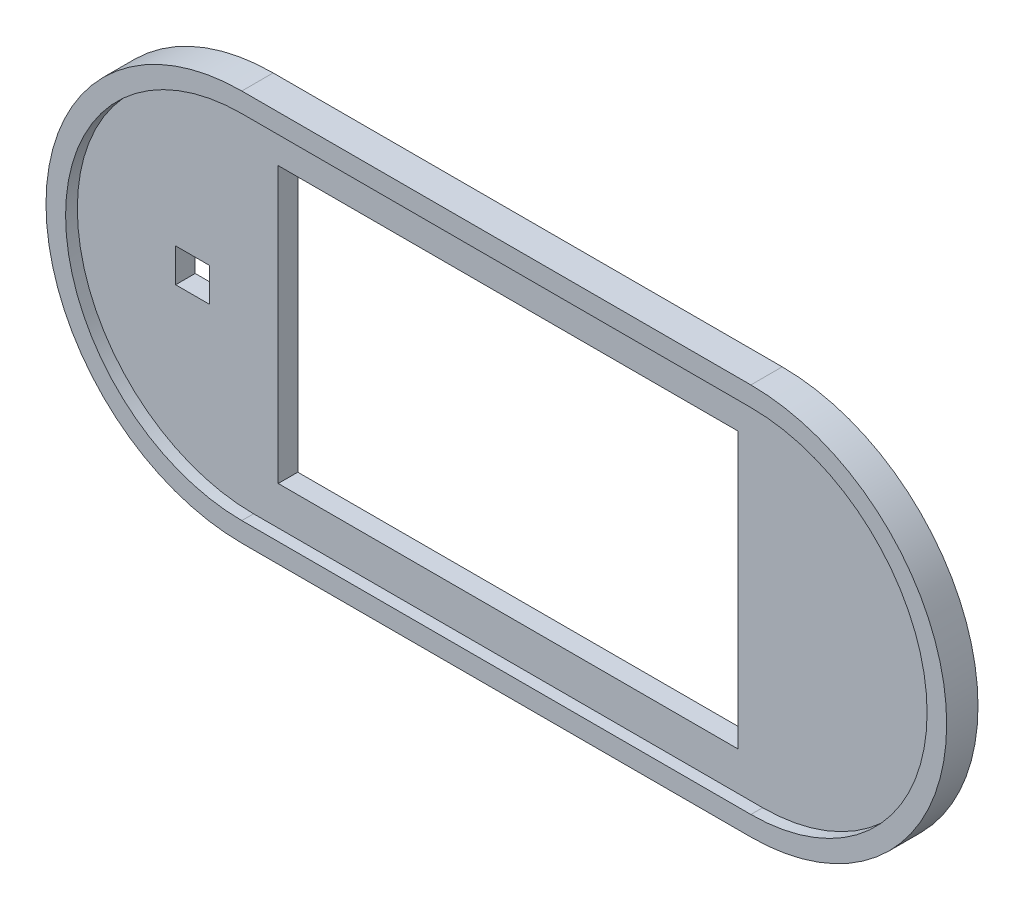
ISO-10303-21;
HEADER;
FILE_DESCRIPTION(('STEP AP214'),'2;1');
FILE_NAME('part.step','',(''),(''),'','','');
FILE_SCHEMA(('AUTOMOTIVE_DESIGN { 1 0 10303 214 1 1 1 1 }'));
ENDSEC;
DATA;
#1=APPLICATION_CONTEXT('core data for automotive mechanical design processes');
#2=APPLICATION_PROTOCOL_DEFINITION('international standard','automotive_design',2000,#1);
#3=PRODUCT_CONTEXT('',#1,'mechanical');
#4=PRODUCT('Part','Part','',(#3));
#5=PRODUCT_RELATED_PRODUCT_CATEGORY('part','',(#4));
#6=PRODUCT_DEFINITION_FORMATION('','',#4);
#7=PRODUCT_DEFINITION_CONTEXT('part definition',#1,'design');
#8=PRODUCT_DEFINITION('design','',#6,#7);
#9=PRODUCT_DEFINITION_SHAPE('','',#8);
#10=(LENGTH_UNIT() NAMED_UNIT(*) SI_UNIT(.MILLI.,.METRE.));
#11=(NAMED_UNIT(*) PLANE_ANGLE_UNIT() SI_UNIT($,.RADIAN.));
#12=(NAMED_UNIT(*) SI_UNIT($,.STERADIAN.) SOLID_ANGLE_UNIT());
#13=UNCERTAINTY_MEASURE_WITH_UNIT(LENGTH_MEASURE(1.E-05),#10,'distance_accuracy_value','');
#14=(GEOMETRIC_REPRESENTATION_CONTEXT(3) GLOBAL_UNCERTAINTY_ASSIGNED_CONTEXT((#13)) GLOBAL_UNIT_ASSIGNED_CONTEXT((#10,
#11,#12)) REPRESENTATION_CONTEXT('',''));
#15=CARTESIAN_POINT('',(0.,0.,0.));
#16=DIRECTION('',(0.,0.,1.));
#17=DIRECTION('',(1.,0.,0.));
#18=AXIS2_PLACEMENT_3D('',#15,#16,#17);
#19=CARTESIAN_POINT('',(0.,-50.,8.));
#20=DIRECTION('',(0.,0.,-1.));
#21=DIRECTION('',(-1.,0.,0.));
#22=AXIS2_PLACEMENT_3D('',#19,#20,#21);
#23=PLANE('',#22);
#24=CARTESIAN_POINT('',(0.,-50.,8.));
#25=DIRECTION('',(0.,0.,1.));
#26=DIRECTION('',(-1.,0.,0.));
#27=AXIS2_PLACEMENT_3D('',#24,#25,#26);
#28=CIRCLE('',#27,50.);
#29=CARTESIAN_POINT('',(0.,-100.,8.));
#30=VERTEX_POINT('',#29);
#31=CARTESIAN_POINT('',(0.,0.,8.));
#32=VERTEX_POINT('',#31);
#33=EDGE_CURVE('E250',#30,#32,#28,.T.);
#34=ORIENTED_EDGE('',*,*,#33,.T.);
#35=DIRECTION('',(-1.,0.,0.));
#36=VECTOR('',#35,1.);
#37=CARTESIAN_POINT('',(0.,0.,8.));
#38=LINE('',#37,#36);
#39=CARTESIAN_POINT('',(-130.,0.,8.));
#40=VERTEX_POINT('',#39);
#41=EDGE_CURVE('E253',#32,#40,#38,.T.);
#42=ORIENTED_EDGE('',*,*,#41,.T.);
#43=CARTESIAN_POINT('',(-130.,-50.,8.));
#44=DIRECTION('',(0.,0.,1.));
#45=DIRECTION('',(1.,0.,0.));
#46=AXIS2_PLACEMENT_3D('',#43,#44,#45);
#47=CIRCLE('',#46,50.);
#48=CARTESIAN_POINT('',(-130.,-100.,8.));
#49=VERTEX_POINT('',#48);
#50=EDGE_CURVE('E256',#40,#49,#47,.T.);
#51=ORIENTED_EDGE('',*,*,#50,.T.);
#52=DIRECTION('',(1.,0.,0.));
#53=VECTOR('',#52,1.);
#54=CARTESIAN_POINT('',(0.,-100.,8.));
#55=LINE('',#54,#53);
#56=EDGE_CURVE('E258',#49,#30,#55,.T.);
#57=ORIENTED_EDGE('',*,*,#56,.T.);
#58=EDGE_LOOP('',(#34,#42,#51,#57));
#59=FACE_BOUND('',#58,.T.);
#60=CARTESIAN_POINT('',(0.,-50.,8.));
#61=DIRECTION('',(0.,0.,-1.));
#62=DIRECTION('',(-1.,0.,0.));
#63=AXIS2_PLACEMENT_3D('',#60,#61,#62);
#64=CIRCLE('',#63,45.);
#65=CARTESIAN_POINT('',(0.,-95.,8.));
#66=VERTEX_POINT('',#65);
#67=CARTESIAN_POINT('',(0.,-5.,8.));
#68=VERTEX_POINT('',#67);
#69=EDGE_CURVE('E242',#66,#68,#64,.F.);
#70=ORIENTED_EDGE('',*,*,#69,.F.);
#71=DIRECTION('',(1.,0.,0.));
#72=VECTOR('',#71,1.);
#73=CARTESIAN_POINT('',(0.,-95.,8.));
#74=LINE('',#73,#72);
#75=CARTESIAN_POINT('',(-130.,-95.,8.));
#76=VERTEX_POINT('',#75);
#77=EDGE_CURVE('E232',#76,#66,#74,.T.);
#78=ORIENTED_EDGE('',*,*,#77,.F.);
#79=CARTESIAN_POINT('',(-130.,-50.,8.));
#80=DIRECTION('',(0.,0.,-1.));
#81=DIRECTION('',(-1.,0.,0.));
#82=AXIS2_PLACEMENT_3D('',#79,#80,#81);
#83=CIRCLE('',#82,45.);
#84=CARTESIAN_POINT('',(-130.,-5.00000000000002,8.));
#85=VERTEX_POINT('',#84);
#86=EDGE_CURVE('E246',#85,#76,#83,.F.);
#87=ORIENTED_EDGE('',*,*,#86,.F.);
#88=DIRECTION('',(-1.,0.,0.));
#89=VECTOR('',#88,1.);
#90=CARTESIAN_POINT('',(0.,-5.,8.));
#91=LINE('',#90,#89);
#92=EDGE_CURVE('E244',#68,#85,#91,.T.);
#93=ORIENTED_EDGE('',*,*,#92,.F.);
#94=EDGE_LOOP('',(#70,#78,#87,#93));
#95=FACE_BOUND('',#94,.T.);
#96=ADVANCED_FACE('F37',(#59,#95),#23,.F.);
#97=CARTESIAN_POINT('',(0.,-50.,8.));
#98=DIRECTION('',(0.,0.,-1.));
#99=DIRECTION('',(-1.,0.,0.));
#100=AXIS2_PLACEMENT_3D('',#97,#98,#99);
#101=CYLINDRICAL_SURFACE('',#100,50.);
#102=CARTESIAN_POINT('',(0.,-50.,0.));
#103=DIRECTION('',(0.,0.,1.));
#104=DIRECTION('',(-1.,0.,0.));
#105=AXIS2_PLACEMENT_3D('',#102,#103,#104);
#106=CIRCLE('',#105,50.);
#107=CARTESIAN_POINT('',(0.,-100.,0.));
#108=VERTEX_POINT('',#107);
#109=CARTESIAN_POINT('',(0.,0.,0.));
#110=VERTEX_POINT('',#109);
#111=EDGE_CURVE('E226',#108,#110,#106,.T.);
#112=ORIENTED_EDGE('',*,*,#111,.T.);
#113=DIRECTION('',(0.,0.,-1.));
#114=VECTOR('',#113,1.);
#115=CARTESIAN_POINT('',(0.,0.,8.));
#116=LINE('',#115,#114);
#117=EDGE_CURVE('E11',#32,#110,#116,.T.);
#118=ORIENTED_EDGE('',*,*,#117,.F.);
#119=ORIENTED_EDGE('',*,*,#33,.F.);
#120=DIRECTION('',(0.,0.,-1.));
#121=VECTOR('',#120,1.);
#122=CARTESIAN_POINT('',(0.,-100.,8.));
#123=LINE('',#122,#121);
#124=EDGE_CURVE('E260',#30,#108,#123,.T.);
#125=ORIENTED_EDGE('',*,*,#124,.T.);
#126=EDGE_LOOP('',(#112,#118,#119,#125));
#127=FACE_BOUND('',#126,.T.);
#128=ADVANCED_FACE('F39',(#127),#101,.T.);
#129=CARTESIAN_POINT('',(0.,0.,8.));
#130=DIRECTION('',(0.,-1.,0.));
#131=DIRECTION('',(1.,0.,0.));
#132=AXIS2_PLACEMENT_3D('',#129,#130,#131);
#133=PLANE('',#132);
#134=DIRECTION('',(-1.,0.,0.));
#135=VECTOR('',#134,1.);
#136=CARTESIAN_POINT('',(0.,0.,0.));
#137=LINE('',#136,#135);
#138=CARTESIAN_POINT('',(-130.,0.,0.));
#139=VERTEX_POINT('',#138);
#140=EDGE_CURVE('E263',#110,#139,#137,.T.);
#141=ORIENTED_EDGE('',*,*,#140,.T.);
#142=DIRECTION('',(0.,0.,-1.));
#143=VECTOR('',#142,1.);
#144=CARTESIAN_POINT('',(-130.,0.,8.));
#145=LINE('',#144,#143);
#146=EDGE_CURVE('E45',#40,#139,#145,.T.);
#147=ORIENTED_EDGE('',*,*,#146,.F.);
#148=ORIENTED_EDGE('',*,*,#41,.F.);
#149=ORIENTED_EDGE('',*,*,#117,.T.);
#150=EDGE_LOOP('',(#141,#147,#148,#149));
#151=FACE_BOUND('',#150,.T.);
#152=ADVANCED_FACE('F293',(#151),#133,.F.);
#153=CARTESIAN_POINT('',(-130.,-50.,8.));
#154=DIRECTION('',(0.,0.,-1.));
#155=DIRECTION('',(-1.,0.,0.));
#156=AXIS2_PLACEMENT_3D('',#153,#154,#155);
#157=CYLINDRICAL_SURFACE('',#156,50.);
#158=CARTESIAN_POINT('',(-130.,-50.,0.));
#159=DIRECTION('',(0.,0.,1.));
#160=DIRECTION('',(1.,0.,0.));
#161=AXIS2_PLACEMENT_3D('',#158,#159,#160);
#162=CIRCLE('',#161,50.);
#163=CARTESIAN_POINT('',(-130.,-100.,0.));
#164=VERTEX_POINT('',#163);
#165=EDGE_CURVE('E265',#139,#164,#162,.T.);
#166=ORIENTED_EDGE('',*,*,#165,.T.);
#167=DIRECTION('',(0.,0.,-1.));
#168=VECTOR('',#167,1.);
#169=CARTESIAN_POINT('',(-130.,-100.,8.));
#170=LINE('',#169,#168);
#171=EDGE_CURVE('E270',#49,#164,#170,.T.);
#172=ORIENTED_EDGE('',*,*,#171,.F.);
#173=ORIENTED_EDGE('',*,*,#50,.F.);
#174=ORIENTED_EDGE('',*,*,#146,.T.);
#175=EDGE_LOOP('',(#166,#172,#173,#174));
#176=FACE_BOUND('',#175,.T.);
#177=ADVANCED_FACE('F277',(#176),#157,.T.);
#178=CARTESIAN_POINT('',(0.,-100.,8.));
#179=DIRECTION('',(0.,1.,0.));
#180=DIRECTION('',(-1.,0.,0.));
#181=AXIS2_PLACEMENT_3D('',#178,#179,#180);
#182=PLANE('',#181);
#183=DIRECTION('',(1.,0.,0.));
#184=VECTOR('',#183,1.);
#185=CARTESIAN_POINT('',(0.,-100.,0.));
#186=LINE('',#185,#184);
#187=EDGE_CURVE('E254',#164,#108,#186,.T.);
#188=ORIENTED_EDGE('',*,*,#187,.T.);
#189=ORIENTED_EDGE('',*,*,#124,.F.);
#190=ORIENTED_EDGE('',*,*,#56,.F.);
#191=ORIENTED_EDGE('',*,*,#171,.T.);
#192=EDGE_LOOP('',(#188,#189,#190,#191));
#193=FACE_BOUND('',#192,.T.);
#194=ADVANCED_FACE('F286',(#193),#182,.F.);
#195=CARTESIAN_POINT('',(0.,-50.,0.));
#196=DIRECTION('',(0.,0.,-1.));
#197=DIRECTION('',(-1.,0.,0.));
#198=AXIS2_PLACEMENT_3D('',#195,#196,#197);
#199=PLANE('',#198);
#200=DIRECTION('',(0.,1.,0.));
#201=VECTOR('',#200,1.);
#202=CARTESIAN_POINT('',(-123.7,-85.15,0.));
#203=LINE('',#202,#201);
#204=CARTESIAN_POINT('',(-123.7,-85.15,0.));
#205=VERTEX_POINT('',#204);
#206=CARTESIAN_POINT('',(-123.7,-14.85,0.));
#207=VERTEX_POINT('',#206);
#208=EDGE_CURVE('E52',#205,#207,#203,.T.);
#209=ORIENTED_EDGE('',*,*,#208,.F.);
#210=DIRECTION('',(-1.,0.,0.));
#211=VECTOR('',#210,1.);
#212=CARTESIAN_POINT('',(-6.29999999999999,-85.15,0.));
#213=LINE('',#212,#211);
#214=CARTESIAN_POINT('',(-6.29999999999999,-85.15,0.));
#215=VERTEX_POINT('',#214);
#216=EDGE_CURVE('E171',#215,#205,#213,.T.);
#217=ORIENTED_EDGE('',*,*,#216,.F.);
#218=DIRECTION('',(0.,-1.,0.));
#219=VECTOR('',#218,1.);
#220=CARTESIAN_POINT('',(-6.29999999999999,-85.15,0.));
#221=LINE('',#220,#219);
#222=CARTESIAN_POINT('',(-6.29999999999999,-14.85,0.));
#223=VERTEX_POINT('',#222);
#224=EDGE_CURVE('E174',#223,#215,#221,.T.);
#225=ORIENTED_EDGE('',*,*,#224,.F.);
#226=DIRECTION('',(1.,0.,0.));
#227=VECTOR('',#226,1.);
#228=CARTESIAN_POINT('',(-6.29999999999999,-14.85,0.));
#229=LINE('',#228,#227);
#230=EDGE_CURVE('E180',#207,#223,#229,.T.);
#231=ORIENTED_EDGE('',*,*,#230,.F.);
#232=EDGE_LOOP('',(#209,#217,#225,#231));
#233=FACE_BOUND('',#232,.T.);
#234=DIRECTION('',(0.,1.,0.));
#235=VECTOR('',#234,1.);
#236=CARTESIAN_POINT('',(-149.896085378825,-45.7,0.));
#237=LINE('',#236,#235);
#238=CARTESIAN_POINT('',(-149.896085378825,-54.3,0.));
#239=VERTEX_POINT('',#238);
#240=CARTESIAN_POINT('',(-149.896085378825,-45.7,0.));
#241=VERTEX_POINT('',#240);
#242=EDGE_CURVE('E60',#239,#241,#237,.T.);
#243=ORIENTED_EDGE('',*,*,#242,.F.);
#244=DIRECTION('',(-1.,0.,0.));
#245=VECTOR('',#244,1.);
#246=CARTESIAN_POINT('',(-141.296085378825,-54.3,0.));
#247=LINE('',#246,#245);
#248=CARTESIAN_POINT('',(-141.296085378825,-54.3,0.));
#249=VERTEX_POINT('',#248);
#250=EDGE_CURVE('E195',#249,#239,#247,.T.);
#251=ORIENTED_EDGE('',*,*,#250,.F.);
#252=DIRECTION('',(0.,-1.,0.));
#253=VECTOR('',#252,1.);
#254=CARTESIAN_POINT('',(-141.296085378825,-45.7,0.));
#255=LINE('',#254,#253);
#256=CARTESIAN_POINT('',(-141.296085378825,-45.7,0.));
#257=VERTEX_POINT('',#256);
#258=EDGE_CURVE('E209',#257,#249,#255,.T.);
#259=ORIENTED_EDGE('',*,*,#258,.F.);
#260=DIRECTION('',(1.,0.,0.));
#261=VECTOR('',#260,1.);
#262=CARTESIAN_POINT('',(-141.296085378825,-45.7,0.));
#263=LINE('',#262,#261);
#264=EDGE_CURVE('E206',#241,#257,#263,.T.);
#265=ORIENTED_EDGE('',*,*,#264,.F.);
#266=EDGE_LOOP('',(#243,#251,#259,#265));
#267=FACE_BOUND('',#266,.T.);
#268=ORIENTED_EDGE('',*,*,#111,.F.);
#269=ORIENTED_EDGE('',*,*,#187,.F.);
#270=ORIENTED_EDGE('',*,*,#165,.F.);
#271=ORIENTED_EDGE('',*,*,#140,.F.);
#272=EDGE_LOOP('',(#268,#269,#270,#271));
#273=FACE_BOUND('',#272,.T.);
#274=ADVANCED_FACE('F283',(#233,#267,#273),#199,.T.);
#275=CARTESIAN_POINT('',(0.,-50.,8.));
#276=DIRECTION('',(0.,0.,-1.));
#277=DIRECTION('',(-1.,0.,0.));
#278=AXIS2_PLACEMENT_3D('',#275,#276,#277);
#279=CYLINDRICAL_SURFACE('',#278,45.);
#280=CARTESIAN_POINT('',(0.,-50.,5.));
#281=DIRECTION('',(0.,0.,-1.));
#282=DIRECTION('',(-1.,0.,0.));
#283=AXIS2_PLACEMENT_3D('',#280,#281,#282);
#284=CIRCLE('',#283,45.);
#285=CARTESIAN_POINT('',(0.,-95.,5.));
#286=VERTEX_POINT('',#285);
#287=CARTESIAN_POINT('',(0.,-5.,5.));
#288=VERTEX_POINT('',#287);
#289=EDGE_CURVE('E187',#286,#288,#284,.F.);
#290=ORIENTED_EDGE('',*,*,#289,.F.);
#291=DIRECTION('',(0.,0.,-1.));
#292=VECTOR('',#291,1.);
#293=CARTESIAN_POINT('',(0.,-95.,8.));
#294=LINE('',#293,#292);
#295=EDGE_CURVE('E228',#66,#286,#294,.T.);
#296=ORIENTED_EDGE('',*,*,#295,.F.);
#297=ORIENTED_EDGE('',*,*,#69,.T.);
#298=DIRECTION('',(0.,0.,1.));
#299=VECTOR('',#298,1.);
#300=CARTESIAN_POINT('',(0.,-5.,8.));
#301=LINE('',#300,#299);
#302=EDGE_CURVE('E223',#68,#288,#301,.F.);
#303=ORIENTED_EDGE('',*,*,#302,.T.);
#304=EDGE_LOOP('',(#290,#296,#297,#303));
#305=FACE_BOUND('',#304,.T.);
#306=ADVANCED_FACE('F309',(#305),#279,.F.);
#307=CARTESIAN_POINT('',(0.,-5.,8.));
#308=DIRECTION('',(0.,-1.,0.));
#309=DIRECTION('',(1.,0.,0.));
#310=AXIS2_PLACEMENT_3D('',#307,#308,#309);
#311=PLANE('',#310);
#312=DIRECTION('',(-1.,0.,0.));
#313=VECTOR('',#312,1.);
#314=CARTESIAN_POINT('',(0.,-5.,5.));
#315=LINE('',#314,#313);
#316=CARTESIAN_POINT('',(-130.,-5.00000000000002,5.));
#317=VERTEX_POINT('',#316);
#318=EDGE_CURVE('E222',#288,#317,#315,.T.);
#319=ORIENTED_EDGE('',*,*,#318,.F.);
#320=ORIENTED_EDGE('',*,*,#302,.F.);
#321=ORIENTED_EDGE('',*,*,#92,.T.);
#322=DIRECTION('',(0.,0.,-1.));
#323=VECTOR('',#322,1.);
#324=CARTESIAN_POINT('',(-130.,-5.00000000000002,8.));
#325=LINE('',#324,#323);
#326=EDGE_CURVE('E227',#85,#317,#325,.T.);
#327=ORIENTED_EDGE('',*,*,#326,.T.);
#328=EDGE_LOOP('',(#319,#320,#321,#327));
#329=FACE_BOUND('',#328,.T.);
#330=ADVANCED_FACE('F328',(#329),#311,.T.);
#331=CARTESIAN_POINT('',(-130.,-50.,8.));
#332=DIRECTION('',(0.,0.,-1.));
#333=DIRECTION('',(-1.,0.,0.));
#334=AXIS2_PLACEMENT_3D('',#331,#332,#333);
#335=CYLINDRICAL_SURFACE('',#334,45.);
#336=CARTESIAN_POINT('',(-130.,-50.,5.));
#337=DIRECTION('',(0.,0.,-1.));
#338=DIRECTION('',(-1.,0.,0.));
#339=AXIS2_PLACEMENT_3D('',#336,#337,#338);
#340=CIRCLE('',#339,45.);
#341=CARTESIAN_POINT('',(-130.,-95.,5.));
#342=VERTEX_POINT('',#341);
#343=EDGE_CURVE('E234',#317,#342,#340,.F.);
#344=ORIENTED_EDGE('',*,*,#343,.F.);
#345=ORIENTED_EDGE('',*,*,#326,.F.);
#346=ORIENTED_EDGE('',*,*,#86,.T.);
#347=DIRECTION('',(0.,0.,1.));
#348=VECTOR('',#347,1.);
#349=CARTESIAN_POINT('',(-130.,-95.,8.));
#350=LINE('',#349,#348);
#351=EDGE_CURVE('E231',#76,#342,#350,.F.);
#352=ORIENTED_EDGE('',*,*,#351,.T.);
#353=EDGE_LOOP('',(#344,#345,#346,#352));
#354=FACE_BOUND('',#353,.T.);
#355=ADVANCED_FACE('F336',(#354),#335,.F.);
#356=CARTESIAN_POINT('',(0.,-95.,8.));
#357=DIRECTION('',(0.,1.,0.));
#358=DIRECTION('',(-1.,0.,0.));
#359=AXIS2_PLACEMENT_3D('',#356,#357,#358);
#360=PLANE('',#359);
#361=DIRECTION('',(1.,0.,0.));
#362=VECTOR('',#361,1.);
#363=CARTESIAN_POINT('',(0.,-95.,5.));
#364=LINE('',#363,#362);
#365=EDGE_CURVE('E238',#342,#286,#364,.T.);
#366=ORIENTED_EDGE('',*,*,#365,.F.);
#367=ORIENTED_EDGE('',*,*,#351,.F.);
#368=ORIENTED_EDGE('',*,*,#77,.T.);
#369=ORIENTED_EDGE('',*,*,#295,.T.);
#370=EDGE_LOOP('',(#366,#367,#368,#369));
#371=FACE_BOUND('',#370,.T.);
#372=ADVANCED_FACE('F344',(#371),#360,.T.);
#373=CARTESIAN_POINT('',(0.,-50.,5.));
#374=DIRECTION('',(0.,0.,-1.));
#375=DIRECTION('',(-1.,0.,0.));
#376=AXIS2_PLACEMENT_3D('',#373,#374,#375);
#377=PLANE('',#376);
#378=DIRECTION('',(-1.,0.,0.));
#379=VECTOR('',#378,1.);
#380=CARTESIAN_POINT('',(-6.29999999999999,-85.15,5.));
#381=LINE('',#380,#379);
#382=CARTESIAN_POINT('',(-6.29999999999999,-85.15,5.));
#383=VERTEX_POINT('',#382);
#384=CARTESIAN_POINT('',(-123.7,-85.15,5.));
#385=VERTEX_POINT('',#384);
#386=EDGE_CURVE('E158',#383,#385,#381,.T.);
#387=ORIENTED_EDGE('',*,*,#386,.T.);
#388=DIRECTION('',(0.,1.,0.));
#389=VECTOR('',#388,1.);
#390=CARTESIAN_POINT('',(-123.7,-85.15,5.));
#391=LINE('',#390,#389);
#392=CARTESIAN_POINT('',(-123.7,-14.85,5.));
#393=VERTEX_POINT('',#392);
#394=EDGE_CURVE('E152',#385,#393,#391,.T.);
#395=ORIENTED_EDGE('',*,*,#394,.T.);
#396=DIRECTION('',(1.,0.,0.));
#397=VECTOR('',#396,1.);
#398=CARTESIAN_POINT('',(-6.29999999999999,-14.85,5.));
#399=LINE('',#398,#397);
#400=CARTESIAN_POINT('',(-6.29999999999999,-14.85,5.));
#401=VERTEX_POINT('',#400);
#402=EDGE_CURVE('E162',#393,#401,#399,.T.);
#403=ORIENTED_EDGE('',*,*,#402,.T.);
#404=DIRECTION('',(0.,-1.,0.));
#405=VECTOR('',#404,1.);
#406=CARTESIAN_POINT('',(-6.29999999999999,-85.15,5.));
#407=LINE('',#406,#405);
#408=EDGE_CURVE('E166',#401,#383,#407,.T.);
#409=ORIENTED_EDGE('',*,*,#408,.T.);
#410=EDGE_LOOP('',(#387,#395,#403,#409));
#411=FACE_BOUND('',#410,.T.);
#412=DIRECTION('',(-1.,0.,0.));
#413=VECTOR('',#412,1.);
#414=CARTESIAN_POINT('',(-141.296085378825,-54.3,5.));
#415=LINE('',#414,#413);
#416=CARTESIAN_POINT('',(-141.296085378825,-54.3,5.));
#417=VERTEX_POINT('',#416);
#418=CARTESIAN_POINT('',(-149.896085378825,-54.3,5.));
#419=VERTEX_POINT('',#418);
#420=EDGE_CURVE('E201',#417,#419,#415,.T.);
#421=ORIENTED_EDGE('',*,*,#420,.T.);
#422=DIRECTION('',(0.,1.,0.));
#423=VECTOR('',#422,1.);
#424=CARTESIAN_POINT('',(-149.896085378825,-45.7,5.));
#425=LINE('',#424,#423);
#426=CARTESIAN_POINT('',(-149.896085378825,-45.7,5.));
#427=VERTEX_POINT('',#426);
#428=EDGE_CURVE('E191',#419,#427,#425,.T.);
#429=ORIENTED_EDGE('',*,*,#428,.T.);
#430=DIRECTION('',(1.,0.,0.));
#431=VECTOR('',#430,1.);
#432=CARTESIAN_POINT('',(-141.296085378825,-45.7,5.));
#433=LINE('',#432,#431);
#434=CARTESIAN_POINT('',(-141.296085378825,-45.7,5.));
#435=VERTEX_POINT('',#434);
#436=EDGE_CURVE('E194',#427,#435,#433,.T.);
#437=ORIENTED_EDGE('',*,*,#436,.T.);
#438=DIRECTION('',(0.,-1.,0.));
#439=VECTOR('',#438,1.);
#440=CARTESIAN_POINT('',(-141.296085378825,-45.7,5.));
#441=LINE('',#440,#439);
#442=EDGE_CURVE('E198',#435,#417,#441,.T.);
#443=ORIENTED_EDGE('',*,*,#442,.T.);
#444=EDGE_LOOP('',(#421,#429,#437,#443));
#445=FACE_BOUND('',#444,.T.);
#446=ORIENTED_EDGE('',*,*,#289,.T.);
#447=ORIENTED_EDGE('',*,*,#318,.T.);
#448=ORIENTED_EDGE('',*,*,#343,.T.);
#449=ORIENTED_EDGE('',*,*,#365,.T.);
#450=EDGE_LOOP('',(#446,#447,#448,#449));
#451=FACE_BOUND('',#450,.T.);
#452=ADVANCED_FACE('F168',(#411,#445,#451),#377,.F.);
#453=CARTESIAN_POINT('',(-149.896085378825,-45.7,5.));
#454=DIRECTION('',(-1.,0.,0.));
#455=DIRECTION('',(0.,0.,1.));
#456=AXIS2_PLACEMENT_3D('',#453,#454,#455);
#457=PLANE('',#456);
#458=ORIENTED_EDGE('',*,*,#242,.T.);
#459=DIRECTION('',(0.,0.,-1.));
#460=VECTOR('',#459,1.);
#461=CARTESIAN_POINT('',(-149.896085378825,-45.7,5.));
#462=LINE('',#461,#460);
#463=EDGE_CURVE('E204',#427,#241,#462,.T.);
#464=ORIENTED_EDGE('',*,*,#463,.F.);
#465=ORIENTED_EDGE('',*,*,#428,.F.);
#466=DIRECTION('',(0.,0.,-1.));
#467=VECTOR('',#466,1.);
#468=CARTESIAN_POINT('',(-149.896085378825,-54.3,5.));
#469=LINE('',#468,#467);
#470=EDGE_CURVE('E181',#419,#239,#469,.T.);
#471=ORIENTED_EDGE('',*,*,#470,.T.);
#472=EDGE_LOOP('',(#458,#464,#465,#471));
#473=FACE_BOUND('',#472,.T.);
#474=ADVANCED_FACE('F356',(#473),#457,.F.);
#475=CARTESIAN_POINT('',(-141.296085378825,-54.3,5.));
#476=DIRECTION('',(0.,-1.,0.));
#477=DIRECTION('',(0.,0.,-1.));
#478=AXIS2_PLACEMENT_3D('',#475,#476,#477);
#479=PLANE('',#478);
#480=ORIENTED_EDGE('',*,*,#250,.T.);
#481=ORIENTED_EDGE('',*,*,#470,.F.);
#482=ORIENTED_EDGE('',*,*,#420,.F.);
#483=DIRECTION('',(0.,0.,-1.));
#484=VECTOR('',#483,1.);
#485=CARTESIAN_POINT('',(-141.296085378825,-54.3,5.));
#486=LINE('',#485,#484);
#487=EDGE_CURVE('E215',#417,#249,#486,.T.);
#488=ORIENTED_EDGE('',*,*,#487,.T.);
#489=EDGE_LOOP('',(#480,#481,#482,#488));
#490=FACE_BOUND('',#489,.T.);
#491=ADVANCED_FACE('F362',(#490),#479,.F.);
#492=CARTESIAN_POINT('',(-141.296085378825,-45.7,5.));
#493=DIRECTION('',(1.,0.,0.));
#494=DIRECTION('',(0.,0.,-1.));
#495=AXIS2_PLACEMENT_3D('',#492,#493,#494);
#496=PLANE('',#495);
#497=ORIENTED_EDGE('',*,*,#258,.T.);
#498=ORIENTED_EDGE('',*,*,#487,.F.);
#499=ORIENTED_EDGE('',*,*,#442,.F.);
#500=DIRECTION('',(0.,0.,-1.));
#501=VECTOR('',#500,1.);
#502=CARTESIAN_POINT('',(-141.296085378825,-45.7,5.));
#503=LINE('',#502,#501);
#504=EDGE_CURVE('E217',#435,#257,#503,.T.);
#505=ORIENTED_EDGE('',*,*,#504,.T.);
#506=EDGE_LOOP('',(#497,#498,#499,#505));
#507=FACE_BOUND('',#506,.T.);
#508=ADVANCED_FACE('F369',(#507),#496,.F.);
#509=CARTESIAN_POINT('',(-141.296085378825,-45.7,5.));
#510=DIRECTION('',(0.,1.,0.));
#511=DIRECTION('',(0.,0.,1.));
#512=AXIS2_PLACEMENT_3D('',#509,#510,#511);
#513=PLANE('',#512);
#514=ORIENTED_EDGE('',*,*,#264,.T.);
#515=ORIENTED_EDGE('',*,*,#504,.F.);
#516=ORIENTED_EDGE('',*,*,#436,.F.);
#517=ORIENTED_EDGE('',*,*,#463,.T.);
#518=EDGE_LOOP('',(#514,#515,#516,#517));
#519=FACE_BOUND('',#518,.T.);
#520=ADVANCED_FACE('F377',(#519),#513,.F.);
#521=CARTESIAN_POINT('',(-123.7,-85.15,5.));
#522=DIRECTION('',(-1.,0.,0.));
#523=DIRECTION('',(0.,0.,1.));
#524=AXIS2_PLACEMENT_3D('',#521,#522,#523);
#525=PLANE('',#524);
#526=ORIENTED_EDGE('',*,*,#208,.T.);
#527=DIRECTION('',(0.,0.,-1.));
#528=VECTOR('',#527,1.);
#529=CARTESIAN_POINT('',(-123.7,-14.85,5.));
#530=LINE('',#529,#528);
#531=EDGE_CURVE('E148',#393,#207,#530,.T.);
#532=ORIENTED_EDGE('',*,*,#531,.F.);
#533=ORIENTED_EDGE('',*,*,#394,.F.);
#534=DIRECTION('',(0.,0.,-1.));
#535=VECTOR('',#534,1.);
#536=CARTESIAN_POINT('',(-123.7,-85.15,5.));
#537=LINE('',#536,#535);
#538=EDGE_CURVE('E185',#385,#205,#537,.T.);
#539=ORIENTED_EDGE('',*,*,#538,.T.);
#540=EDGE_LOOP('',(#526,#532,#533,#539));
#541=FACE_BOUND('',#540,.T.);
#542=ADVANCED_FACE('F150',(#541),#525,.F.);
#543=CARTESIAN_POINT('',(-6.29999999999999,-85.15,5.));
#544=DIRECTION('',(0.,-1.,0.));
#545=DIRECTION('',(0.,0.,-1.));
#546=AXIS2_PLACEMENT_3D('',#543,#544,#545);
#547=PLANE('',#546);
#548=ORIENTED_EDGE('',*,*,#216,.T.);
#549=ORIENTED_EDGE('',*,*,#538,.F.);
#550=ORIENTED_EDGE('',*,*,#386,.F.);
#551=DIRECTION('',(0.,0.,-1.));
#552=VECTOR('',#551,1.);
#553=CARTESIAN_POINT('',(-6.29999999999999,-85.15,5.));
#554=LINE('',#553,#552);
#555=EDGE_CURVE('E188',#383,#215,#554,.T.);
#556=ORIENTED_EDGE('',*,*,#555,.T.);
#557=EDGE_LOOP('',(#548,#549,#550,#556));
#558=FACE_BOUND('',#557,.T.);
#559=ADVANCED_FACE('F392',(#558),#547,.F.);
#560=CARTESIAN_POINT('',(-6.29999999999999,-85.15,5.));
#561=DIRECTION('',(1.,0.,0.));
#562=DIRECTION('',(0.,0.,-1.));
#563=AXIS2_PLACEMENT_3D('',#560,#561,#562);
#564=PLANE('',#563);
#565=ORIENTED_EDGE('',*,*,#224,.T.);
#566=ORIENTED_EDGE('',*,*,#555,.F.);
#567=ORIENTED_EDGE('',*,*,#408,.F.);
#568=DIRECTION('',(0.,0.,-1.));
#569=VECTOR('',#568,1.);
#570=CARTESIAN_POINT('',(-6.29999999999999,-14.85,5.));
#571=LINE('',#570,#569);
#572=EDGE_CURVE('E157',#401,#223,#571,.T.);
#573=ORIENTED_EDGE('',*,*,#572,.T.);
#574=EDGE_LOOP('',(#565,#566,#567,#573));
#575=FACE_BOUND('',#574,.T.);
#576=ADVANCED_FACE('F399',(#575),#564,.F.);
#577=CARTESIAN_POINT('',(-6.29999999999999,-14.85,5.));
#578=DIRECTION('',(0.,1.,0.));
#579=DIRECTION('',(0.,0.,1.));
#580=AXIS2_PLACEMENT_3D('',#577,#578,#579);
#581=PLANE('',#580);
#582=ORIENTED_EDGE('',*,*,#230,.T.);
#583=ORIENTED_EDGE('',*,*,#572,.F.);
#584=ORIENTED_EDGE('',*,*,#402,.F.);
#585=ORIENTED_EDGE('',*,*,#531,.T.);
#586=EDGE_LOOP('',(#582,#583,#584,#585));
#587=FACE_BOUND('',#586,.T.);
#588=ADVANCED_FACE('F163',(#587),#581,.F.);
#589=CLOSED_SHELL('',(#96,#128,#152,#177,#194,#274,#306,#330,#355,#372,#452,#474,#491,#508,#520,
#542,#559,#576,#588));
#590=MANIFOLD_SOLID_BREP('B2',#589);
#591=ADVANCED_BREP_SHAPE_REPRESENTATION('',(#18,#590),#14);
#592=SHAPE_DEFINITION_REPRESENTATION(#9,#591);
ENDSEC;
END-ISO-10303-21;
